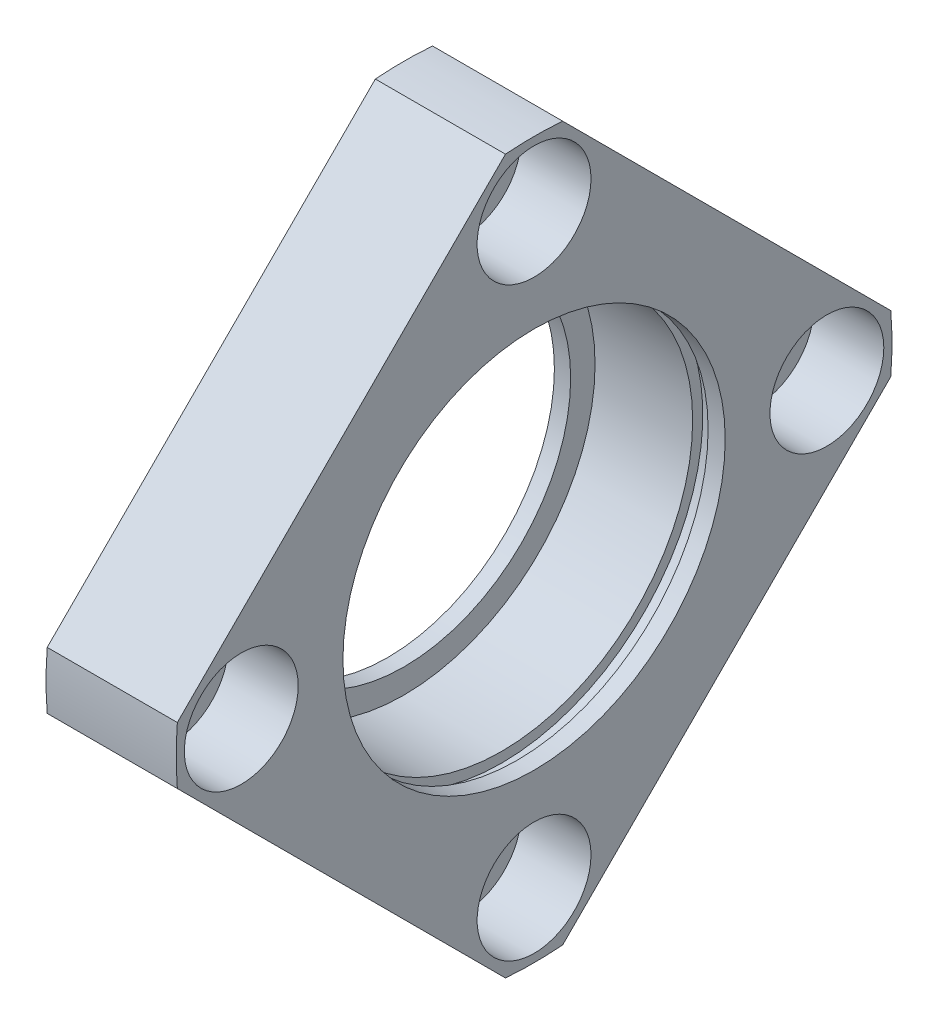
ISO-10303-21;
HEADER;
FILE_DESCRIPTION(('STEP AP214'),'2;1');
FILE_NAME('part.step','',(''),(''),'','','');
FILE_SCHEMA(('AUTOMOTIVE_DESIGN { 1 0 10303 214 1 1 1 1 }'));
ENDSEC;
DATA;
#1=APPLICATION_CONTEXT('core data for automotive mechanical design processes');
#2=APPLICATION_PROTOCOL_DEFINITION('international standard','automotive_design',2000,#1);
#3=PRODUCT_CONTEXT('',#1,'mechanical');
#4=PRODUCT('Part','Part','',(#3));
#5=PRODUCT_RELATED_PRODUCT_CATEGORY('part','',(#4));
#6=PRODUCT_DEFINITION_FORMATION('','',#4);
#7=PRODUCT_DEFINITION_CONTEXT('part definition',#1,'design');
#8=PRODUCT_DEFINITION('design','',#6,#7);
#9=PRODUCT_DEFINITION_SHAPE('','',#8);
#10=(LENGTH_UNIT() NAMED_UNIT(*) SI_UNIT(.MILLI.,.METRE.));
#11=(NAMED_UNIT(*) PLANE_ANGLE_UNIT() SI_UNIT($,.RADIAN.));
#12=(NAMED_UNIT(*) SI_UNIT($,.STERADIAN.) SOLID_ANGLE_UNIT());
#13=UNCERTAINTY_MEASURE_WITH_UNIT(LENGTH_MEASURE(1.E-05),#10,'distance_accuracy_value','');
#14=(GEOMETRIC_REPRESENTATION_CONTEXT(3) GLOBAL_UNCERTAINTY_ASSIGNED_CONTEXT((#13)) GLOBAL_UNIT_ASSIGNED_CONTEXT((#10,
#11,#12)) REPRESENTATION_CONTEXT('',''));
#15=CARTESIAN_POINT('',(0.,0.,0.));
#16=DIRECTION('',(0.,0.,1.));
#17=DIRECTION('',(1.,0.,0.));
#18=AXIS2_PLACEMENT_3D('',#15,#16,#17);
#19=CARTESIAN_POINT('',(-16.,44.,0.));
#20=DIRECTION('',(-1.,0.,0.));
#21=DIRECTION('',(0.,-1.,0.));
#22=AXIS2_PLACEMENT_3D('',#19,#20,#21);
#23=PLANE('',#22);
#24=CARTESIAN_POINT('',(-16.,36.,0.));
#25=DIRECTION('',(-1.,0.,0.));
#26=DIRECTION('',(0.,-1.,0.));
#27=AXIS2_PLACEMENT_3D('',#24,#25,#26);
#28=CIRCLE('',#27,4.25);
#29=CARTESIAN_POINT('',(-16.,31.75,0.));
#30=VERTEX_POINT('',#29);
#31=EDGE_CURVE('E501',#30,#30,#28,.T.);
#32=ORIENTED_EDGE('',*,*,#31,.F.);
#33=EDGE_LOOP('',(#32));
#34=FACE_BOUND('',#33,.T.);
#35=CARTESIAN_POINT('',(-16.,0.,36.));
#36=DIRECTION('',(-1.,0.,0.));
#37=DIRECTION('',(0.,-1.,0.));
#38=AXIS2_PLACEMENT_3D('',#35,#36,#37);
#39=CIRCLE('',#38,4.25);
#40=CARTESIAN_POINT('',(-16.,-4.25,36.));
#41=VERTEX_POINT('',#40);
#42=EDGE_CURVE('E507',#41,#41,#39,.T.);
#43=ORIENTED_EDGE('',*,*,#42,.F.);
#44=EDGE_LOOP('',(#43));
#45=FACE_BOUND('',#44,.T.);
#46=CARTESIAN_POINT('',(-16.,-36.,0.));
#47=DIRECTION('',(-1.,0.,0.));
#48=DIRECTION('',(0.,-1.,0.));
#49=AXIS2_PLACEMENT_3D('',#46,#47,#48);
#50=CIRCLE('',#49,4.25);
#51=CARTESIAN_POINT('',(-16.,-40.25,0.));
#52=VERTEX_POINT('',#51);
#53=EDGE_CURVE('E513',#52,#52,#50,.T.);
#54=ORIENTED_EDGE('',*,*,#53,.F.);
#55=EDGE_LOOP('',(#54));
#56=FACE_BOUND('',#55,.T.);
#57=CARTESIAN_POINT('',(-16.,0.,-36.));
#58=DIRECTION('',(-1.,0.,0.));
#59=DIRECTION('',(0.,-1.,0.));
#60=AXIS2_PLACEMENT_3D('',#57,#58,#59);
#61=CIRCLE('',#60,4.25);
#62=CARTESIAN_POINT('',(-16.,-4.25,-36.));
#63=VERTEX_POINT('',#62);
#64=EDGE_CURVE('E519',#63,#63,#61,.T.);
#65=ORIENTED_EDGE('',*,*,#64,.F.);
#66=EDGE_LOOP('',(#65));
#67=FACE_BOUND('',#66,.T.);
#68=CARTESIAN_POINT('',(-16.,0.,0.));
#69=DIRECTION('',(-1.,0.,0.));
#70=DIRECTION('',(0.,-1.,0.));
#71=AXIS2_PLACEMENT_3D('',#68,#69,#70);
#72=CIRCLE('',#71,27.3);
#73=CARTESIAN_POINT('',(-16.,-27.3,0.));
#74=VERTEX_POINT('',#73);
#75=EDGE_CURVE('E45',#74,#74,#72,.F.);
#76=ORIENTED_EDGE('',*,*,#75,.T.);
#77=EDGE_LOOP('',(#76));
#78=FACE_BOUND('',#77,.T.);
#79=CARTESIAN_POINT('',(-16.,0.,0.));
#80=DIRECTION('',(1.,0.,0.));
#81=DIRECTION('',(0.,1.,0.));
#82=AXIS2_PLACEMENT_3D('',#79,#80,#81);
#83=CIRCLE('',#82,44.);
#84=CARTESIAN_POINT('',(-16.,43.8592199236936,-3.51693441580502));
#85=VERTEX_POINT('',#84);
#86=CARTESIAN_POINT('',(-16.,43.8592199236936,3.51693441580502));
#87=VERTEX_POINT('',#86);
#88=EDGE_CURVE('E133',#85,#87,#83,.T.);
#89=ORIENTED_EDGE('',*,*,#88,.F.);
#90=DIRECTION('',(0.,-0.707106781186548,-0.707106781186548));
#91=VECTOR('',#90,1.);
#92=CARTESIAN_POINT('',(-16.,43.8592199236936,-3.51693441580502));
#93=LINE('',#92,#91);
#94=CARTESIAN_POINT('',(-16.,3.51693441580502,-43.8592199236936));
#95=VERTEX_POINT('',#94);
#96=EDGE_CURVE('E103',#85,#95,#93,.T.);
#97=ORIENTED_EDGE('',*,*,#96,.T.);
#98=CARTESIAN_POINT('',(-16.,-3.51693441580502,-43.8592199236936));
#99=VERTEX_POINT('',#98);
#100=EDGE_CURVE('E135',#99,#95,#83,.T.);
#101=ORIENTED_EDGE('',*,*,#100,.F.);
#102=DIRECTION('',(0.,-0.707106781186548,0.707106781186547));
#103=VECTOR('',#102,1.);
#104=CARTESIAN_POINT('',(-16.,-3.51693441580502,-43.8592199236936));
#105=LINE('',#104,#103);
#106=CARTESIAN_POINT('',(-16.,-43.8592199236936,-3.51693441580504));
#107=VERTEX_POINT('',#106);
#108=EDGE_CURVE('E471',#99,#107,#105,.T.);
#109=ORIENTED_EDGE('',*,*,#108,.T.);
#110=CARTESIAN_POINT('',(-16.,-43.8592199236936,3.51693441580503));
#111=VERTEX_POINT('',#110);
#112=EDGE_CURVE('E136',#111,#107,#83,.T.);
#113=ORIENTED_EDGE('',*,*,#112,.F.);
#114=DIRECTION('',(0.,0.707106781186547,0.707106781186547));
#115=VECTOR('',#114,1.);
#116=CARTESIAN_POINT('',(-16.,-43.8592199236936,3.51693441580503));
#117=LINE('',#116,#115);
#118=CARTESIAN_POINT('',(-16.,-3.51693441580503,43.8592199236936));
#119=VERTEX_POINT('',#118);
#120=EDGE_CURVE('E107',#111,#119,#117,.T.);
#121=ORIENTED_EDGE('',*,*,#120,.T.);
#122=CARTESIAN_POINT('',(-16.,3.51693441580501,43.8592199236936));
#123=VERTEX_POINT('',#122);
#124=EDGE_CURVE('E137',#123,#119,#83,.T.);
#125=ORIENTED_EDGE('',*,*,#124,.F.);
#126=DIRECTION('',(0.,0.707106781186548,-0.707106781186547));
#127=VECTOR('',#126,1.);
#128=CARTESIAN_POINT('',(-16.,3.51693441580501,43.8592199236936));
#129=LINE('',#128,#127);
#130=EDGE_CURVE('E491',#123,#87,#129,.T.);
#131=ORIENTED_EDGE('',*,*,#130,.T.);
#132=EDGE_LOOP('',(#89,#97,#101,#109,#113,#121,#125,#131));
#133=FACE_BOUND('',#132,.T.);
#134=ADVANCED_FACE('F37',(#34,#45,#56,#67,#78,#133),#23,.T.);
#135=CARTESIAN_POINT('',(0.,23.5,0.));
#136=DIRECTION('',(1.,0.,0.));
#137=DIRECTION('',(0.,1.,0.));
#138=AXIS2_PLACEMENT_3D('',#135,#136,#137);
#139=PLANE('',#138);
#140=CARTESIAN_POINT('',(0.,36.,0.));
#141=DIRECTION('',(1.,0.,0.));
#142=DIRECTION('',(0.,0.,-1.));
#143=AXIS2_PLACEMENT_3D('',#140,#141,#142);
#144=CIRCLE('',#143,7.);
#145=CARTESIAN_POINT('',(0.,36.,-7.));
#146=VERTEX_POINT('',#145);
#147=EDGE_CURVE('E522',#146,#146,#144,.T.);
#148=ORIENTED_EDGE('',*,*,#147,.F.);
#149=EDGE_LOOP('',(#148));
#150=FACE_BOUND('',#149,.T.);
#151=CARTESIAN_POINT('',(0.,0.,36.));
#152=DIRECTION('',(1.,0.,0.));
#153=DIRECTION('',(0.,0.,-1.));
#154=AXIS2_PLACEMENT_3D('',#151,#152,#153);
#155=CIRCLE('',#154,7.);
#156=CARTESIAN_POINT('',(0.,0.,29.));
#157=VERTEX_POINT('',#156);
#158=EDGE_CURVE('E528',#157,#157,#155,.T.);
#159=ORIENTED_EDGE('',*,*,#158,.F.);
#160=EDGE_LOOP('',(#159));
#161=FACE_BOUND('',#160,.T.);
#162=CARTESIAN_POINT('',(0.,0.,-36.));
#163=DIRECTION('',(1.,0.,0.));
#164=DIRECTION('',(0.,0.,-1.));
#165=AXIS2_PLACEMENT_3D('',#162,#163,#164);
#166=CIRCLE('',#165,7.);
#167=CARTESIAN_POINT('',(0.,0.,-43.));
#168=VERTEX_POINT('',#167);
#169=EDGE_CURVE('E534',#168,#168,#166,.T.);
#170=ORIENTED_EDGE('',*,*,#169,.F.);
#171=EDGE_LOOP('',(#170));
#172=FACE_BOUND('',#171,.T.);
#173=CARTESIAN_POINT('',(0.,-36.,0.));
#174=DIRECTION('',(1.,0.,0.));
#175=DIRECTION('',(0.,0.,-1.));
#176=AXIS2_PLACEMENT_3D('',#173,#174,#175);
#177=CIRCLE('',#176,7.);
#178=CARTESIAN_POINT('',(0.,-36.,-7.));
#179=VERTEX_POINT('',#178);
#180=EDGE_CURVE('E540',#179,#179,#177,.T.);
#181=ORIENTED_EDGE('',*,*,#180,.F.);
#182=EDGE_LOOP('',(#181));
#183=FACE_BOUND('',#182,.T.);
#184=CARTESIAN_POINT('',(0.,0.,0.));
#185=DIRECTION('',(1.,0.,0.));
#186=DIRECTION('',(0.,1.,0.));
#187=AXIS2_PLACEMENT_3D('',#184,#185,#186);
#188=CIRCLE('',#187,23.5);
#189=CARTESIAN_POINT('',(0.,23.5,0.));
#190=VERTEX_POINT('',#189);
#191=EDGE_CURVE('E124',#190,#190,#188,.T.);
#192=ORIENTED_EDGE('',*,*,#191,.F.);
#193=EDGE_LOOP('',(#192));
#194=FACE_BOUND('',#193,.T.);
#195=CARTESIAN_POINT('',(0.,0.,0.));
#196=DIRECTION('',(1.,0.,0.));
#197=DIRECTION('',(0.,1.,0.));
#198=AXIS2_PLACEMENT_3D('',#195,#196,#197);
#199=CIRCLE('',#198,44.);
#200=CARTESIAN_POINT('',(0.,-3.516934415805,-43.8592199236937));
#201=VERTEX_POINT('',#200);
#202=CARTESIAN_POINT('',(0.,3.51693441580502,-43.8592199236936));
#203=VERTEX_POINT('',#202);
#204=EDGE_CURVE('E118',#201,#203,#199,.T.);
#205=ORIENTED_EDGE('',*,*,#204,.T.);
#206=DIRECTION('',(0.,-0.707106781186548,-0.707106781186548));
#207=VECTOR('',#206,1.);
#208=CARTESIAN_POINT('',(0.,43.8592199236936,-3.51693441580502));
#209=LINE('',#208,#207);
#210=CARTESIAN_POINT('',(0.,43.8592199236936,-3.51693441580502));
#211=VERTEX_POINT('',#210);
#212=EDGE_CURVE('E52',#211,#203,#209,.T.);
#213=ORIENTED_EDGE('',*,*,#212,.F.);
#214=CARTESIAN_POINT('',(0.,43.8592199236936,3.51693441580502));
#215=VERTEX_POINT('',#214);
#216=EDGE_CURVE('E114',#211,#215,#199,.T.);
#217=ORIENTED_EDGE('',*,*,#216,.T.);
#218=DIRECTION('',(0.,0.707106781186548,-0.707106781186547));
#219=VECTOR('',#218,1.);
#220=CARTESIAN_POINT('',(0.,3.51693441580501,43.8592199236936));
#221=LINE('',#220,#219);
#222=CARTESIAN_POINT('',(0.,3.516934415805,43.8592199236937));
#223=VERTEX_POINT('',#222);
#224=EDGE_CURVE('E492',#223,#215,#221,.T.);
#225=ORIENTED_EDGE('',*,*,#224,.F.);
#226=CARTESIAN_POINT('',(0.,-3.51693441580503,43.8592199236936));
#227=VERTEX_POINT('',#226);
#228=EDGE_CURVE('E127',#223,#227,#199,.T.);
#229=ORIENTED_EDGE('',*,*,#228,.T.);
#230=DIRECTION('',(0.,0.707106781186547,0.707106781186547));
#231=VECTOR('',#230,1.);
#232=CARTESIAN_POINT('',(0.,-43.8592199236936,3.51693441580503));
#233=LINE('',#232,#231);
#234=CARTESIAN_POINT('',(0.,-43.8592199236937,3.51693441580501));
#235=VERTEX_POINT('',#234);
#236=EDGE_CURVE('E476',#235,#227,#233,.T.);
#237=ORIENTED_EDGE('',*,*,#236,.F.);
#238=CARTESIAN_POINT('',(0.,-43.8592199236936,-3.51693441580504));
#239=VERTEX_POINT('',#238);
#240=EDGE_CURVE('E126',#235,#239,#199,.T.);
#241=ORIENTED_EDGE('',*,*,#240,.T.);
#242=DIRECTION('',(0.,-0.707106781186548,0.707106781186547));
#243=VECTOR('',#242,1.);
#244=CARTESIAN_POINT('',(0.,-3.51693441580502,-43.8592199236936));
#245=LINE('',#244,#243);
#246=EDGE_CURVE('E483',#201,#239,#245,.T.);
#247=ORIENTED_EDGE('',*,*,#246,.F.);
#248=EDGE_LOOP('',(#205,#213,#217,#225,#229,#237,#241,#247));
#249=FACE_BOUND('',#248,.T.);
#250=ADVANCED_FACE('F112',(#150,#161,#172,#183,#194,#249),#139,.T.);
#251=CARTESIAN_POINT('',(0.,0.,0.));
#252=DIRECTION('',(1.,0.,0.));
#253=DIRECTION('',(0.,1.,0.));
#254=AXIS2_PLACEMENT_3D('',#251,#252,#253);
#255=CYLINDRICAL_SURFACE('',#254,44.);
#256=ORIENTED_EDGE('',*,*,#216,.F.);
#257=DIRECTION('',(-1.,0.,0.));
#258=VECTOR('',#257,1.);
#259=CARTESIAN_POINT('',(0.,43.8592199236936,-3.51693441580502));
#260=LINE('',#259,#258);
#261=EDGE_CURVE('E100',#211,#85,#260,.T.);
#262=ORIENTED_EDGE('',*,*,#261,.T.);
#263=ORIENTED_EDGE('',*,*,#88,.T.);
#264=DIRECTION('',(-1.,0.,0.));
#265=VECTOR('',#264,1.);
#266=CARTESIAN_POINT('',(0.,43.8592199236936,3.51693441580502));
#267=LINE('',#266,#265);
#268=EDGE_CURVE('E123',#215,#87,#267,.T.);
#269=ORIENTED_EDGE('',*,*,#268,.F.);
#270=EDGE_LOOP('',(#256,#262,#263,#269));
#271=FACE_BOUND('',#270,.T.);
#272=ADVANCED_FACE('F121',(#271),#255,.T.);
#273=ORIENTED_EDGE('',*,*,#100,.T.);
#274=DIRECTION('',(-1.,0.,0.));
#275=VECTOR('',#274,1.);
#276=CARTESIAN_POINT('',(0.,3.51693441580502,-43.8592199236936));
#277=LINE('',#276,#275);
#278=EDGE_CURVE('E108',#203,#95,#277,.T.);
#279=ORIENTED_EDGE('',*,*,#278,.F.);
#280=ORIENTED_EDGE('',*,*,#204,.F.);
#281=DIRECTION('',(-1.,0.,0.));
#282=VECTOR('',#281,1.);
#283=CARTESIAN_POINT('',(0.,-3.51693441580502,-43.8592199236936));
#284=LINE('',#283,#282);
#285=EDGE_CURVE('E468',#201,#99,#284,.T.);
#286=ORIENTED_EDGE('',*,*,#285,.T.);
#287=EDGE_LOOP('',(#273,#279,#280,#286));
#288=FACE_BOUND('',#287,.T.);
#289=ADVANCED_FACE('F175',(#288),#255,.T.);
#290=ORIENTED_EDGE('',*,*,#240,.F.);
#291=DIRECTION('',(-1.,0.,0.));
#292=VECTOR('',#291,1.);
#293=CARTESIAN_POINT('',(0.,-43.8592199236936,3.51693441580503));
#294=LINE('',#293,#292);
#295=EDGE_CURVE('E60',#235,#111,#294,.T.);
#296=ORIENTED_EDGE('',*,*,#295,.T.);
#297=ORIENTED_EDGE('',*,*,#112,.T.);
#298=DIRECTION('',(-1.,0.,0.));
#299=VECTOR('',#298,1.);
#300=CARTESIAN_POINT('',(0.,-43.8592199236936,-3.51693441580504));
#301=LINE('',#300,#299);
#302=EDGE_CURVE('E486',#239,#107,#301,.T.);
#303=ORIENTED_EDGE('',*,*,#302,.F.);
#304=EDGE_LOOP('',(#290,#296,#297,#303));
#305=FACE_BOUND('',#304,.T.);
#306=ADVANCED_FACE('F370',(#305),#255,.T.);
#307=ORIENTED_EDGE('',*,*,#124,.T.);
#308=DIRECTION('',(-1.,0.,0.));
#309=VECTOR('',#308,1.);
#310=CARTESIAN_POINT('',(0.,-3.51693441580503,43.8592199236936));
#311=LINE('',#310,#309);
#312=EDGE_CURVE('E478',#227,#119,#311,.T.);
#313=ORIENTED_EDGE('',*,*,#312,.F.);
#314=ORIENTED_EDGE('',*,*,#228,.F.);
#315=DIRECTION('',(-1.,0.,0.));
#316=VECTOR('',#315,1.);
#317=CARTESIAN_POINT('',(0.,3.51693441580501,43.8592199236936));
#318=LINE('',#317,#316);
#319=EDGE_CURVE('E496',#223,#123,#318,.T.);
#320=ORIENTED_EDGE('',*,*,#319,.T.);
#321=EDGE_LOOP('',(#307,#313,#314,#320));
#322=FACE_BOUND('',#321,.T.);
#323=ADVANCED_FACE('F176',(#322),#255,.T.);
#324=CARTESIAN_POINT('',(0.,0.,0.));
#325=DIRECTION('',(1.,0.,0.));
#326=DIRECTION('',(0.,1.,0.));
#327=AXIS2_PLACEMENT_3D('',#324,#325,#326);
#328=CYLINDRICAL_SURFACE('',#327,23.5);
#329=ORIENTED_EDGE('',*,*,#191,.T.);
#330=EDGE_LOOP('',(#329));
#331=FACE_BOUND('',#330,.T.);
#332=CARTESIAN_POINT('',(-2.1,0.,0.));
#333=DIRECTION('',(1.,0.,0.));
#334=DIRECTION('',(0.,1.,0.));
#335=AXIS2_PLACEMENT_3D('',#332,#333,#334);
#336=CIRCLE('',#335,23.5);
#337=CARTESIAN_POINT('',(-2.1,23.5,0.));
#338=VERTEX_POINT('',#337);
#339=EDGE_CURVE('E129',#338,#338,#336,.T.);
#340=ORIENTED_EDGE('',*,*,#339,.F.);
#341=EDGE_LOOP('',(#340));
#342=FACE_BOUND('',#341,.T.);
#343=ADVANCED_FACE('F178',(#331,#342),#328,.F.);
#344=CARTESIAN_POINT('',(-2.1,24.75,0.));
#345=DIRECTION('',(-1.,0.,0.));
#346=DIRECTION('',(0.,-1.,0.));
#347=AXIS2_PLACEMENT_3D('',#344,#345,#346);
#348=PLANE('',#347);
#349=ORIENTED_EDGE('',*,*,#339,.T.);
#350=EDGE_LOOP('',(#349));
#351=FACE_BOUND('',#350,.T.);
#352=CARTESIAN_POINT('',(-2.1,0.,0.));
#353=DIRECTION('',(1.,0.,0.));
#354=DIRECTION('',(0.,1.,0.));
#355=AXIS2_PLACEMENT_3D('',#352,#353,#354);
#356=CIRCLE('',#355,24.75);
#357=CARTESIAN_POINT('',(-2.1,24.75,0.));
#358=VERTEX_POINT('',#357);
#359=EDGE_CURVE('E564',#358,#358,#356,.T.);
#360=ORIENTED_EDGE('',*,*,#359,.F.);
#361=EDGE_LOOP('',(#360));
#362=FACE_BOUND('',#361,.T.);
#363=ADVANCED_FACE('F181',(#351,#362),#348,.T.);
#364=CARTESIAN_POINT('',(0.,0.,0.));
#365=DIRECTION('',(1.,0.,0.));
#366=DIRECTION('',(0.,1.,0.));
#367=AXIS2_PLACEMENT_3D('',#364,#365,#366);
#368=CYLINDRICAL_SURFACE('',#367,24.75);
#369=ORIENTED_EDGE('',*,*,#359,.T.);
#370=EDGE_LOOP('',(#369));
#371=FACE_BOUND('',#370,.T.);
#372=CARTESIAN_POINT('',(-4.,0.,0.));
#373=DIRECTION('',(1.,0.,0.));
#374=DIRECTION('',(0.,1.,0.));
#375=AXIS2_PLACEMENT_3D('',#372,#373,#374);
#376=CIRCLE('',#375,24.75);
#377=CARTESIAN_POINT('',(-4.,24.75,0.));
#378=VERTEX_POINT('',#377);
#379=EDGE_CURVE('E561',#378,#378,#376,.T.);
#380=ORIENTED_EDGE('',*,*,#379,.F.);
#381=EDGE_LOOP('',(#380));
#382=FACE_BOUND('',#381,.T.);
#383=ADVANCED_FACE('F185',(#371,#382),#368,.F.);
#384=CARTESIAN_POINT('',(-4.,23.5,0.));
#385=DIRECTION('',(1.,0.,0.));
#386=DIRECTION('',(0.,1.,0.));
#387=AXIS2_PLACEMENT_3D('',#384,#385,#386);
#388=PLANE('',#387);
#389=ORIENTED_EDGE('',*,*,#379,.T.);
#390=EDGE_LOOP('',(#389));
#391=FACE_BOUND('',#390,.T.);
#392=CARTESIAN_POINT('',(-4.,0.,0.));
#393=DIRECTION('',(1.,0.,0.));
#394=DIRECTION('',(0.,1.,0.));
#395=AXIS2_PLACEMENT_3D('',#392,#393,#394);
#396=CIRCLE('',#395,23.5);
#397=CARTESIAN_POINT('',(-4.,23.5,0.));
#398=VERTEX_POINT('',#397);
#399=EDGE_CURVE('E558',#398,#398,#396,.T.);
#400=ORIENTED_EDGE('',*,*,#399,.F.);
#401=EDGE_LOOP('',(#400));
#402=FACE_BOUND('',#401,.T.);
#403=ADVANCED_FACE('F189',(#391,#402),#388,.T.);
#404=CARTESIAN_POINT('',(0.,0.,0.));
#405=DIRECTION('',(1.,0.,0.));
#406=DIRECTION('',(0.,1.,0.));
#407=AXIS2_PLACEMENT_3D('',#404,#405,#406);
#408=CYLINDRICAL_SURFACE('',#407,23.5);
#409=ORIENTED_EDGE('',*,*,#399,.T.);
#410=EDGE_LOOP('',(#409));
#411=FACE_BOUND('',#410,.T.);
#412=CARTESIAN_POINT('',(-16.,0.,0.));
#413=DIRECTION('',(1.,0.,0.));
#414=DIRECTION('',(0.,1.,0.));
#415=AXIS2_PLACEMENT_3D('',#412,#413,#414);
#416=CIRCLE('',#415,23.5);
#417=CARTESIAN_POINT('',(-16.,23.5,0.));
#418=VERTEX_POINT('',#417);
#419=EDGE_CURVE('E555',#418,#418,#416,.T.);
#420=ORIENTED_EDGE('',*,*,#419,.F.);
#421=EDGE_LOOP('',(#420));
#422=FACE_BOUND('',#421,.T.);
#423=ADVANCED_FACE('F193',(#411,#422),#408,.F.);
#424=CARTESIAN_POINT('',(-16.,20.5,0.));
#425=DIRECTION('',(1.,0.,0.));
#426=DIRECTION('',(0.,1.,0.));
#427=AXIS2_PLACEMENT_3D('',#424,#425,#426);
#428=PLANE('',#427);
#429=ORIENTED_EDGE('',*,*,#419,.T.);
#430=EDGE_LOOP('',(#429));
#431=FACE_BOUND('',#430,.T.);
#432=CARTESIAN_POINT('',(-16.,0.,0.));
#433=DIRECTION('',(1.,0.,0.));
#434=DIRECTION('',(0.,1.,0.));
#435=AXIS2_PLACEMENT_3D('',#432,#433,#434);
#436=CIRCLE('',#435,20.5);
#437=CARTESIAN_POINT('',(-16.,20.5,0.));
#438=VERTEX_POINT('',#437);
#439=EDGE_CURVE('E552',#438,#438,#436,.T.);
#440=ORIENTED_EDGE('',*,*,#439,.F.);
#441=EDGE_LOOP('',(#440));
#442=FACE_BOUND('',#441,.T.);
#443=ADVANCED_FACE('F197',(#431,#442),#428,.T.);
#444=CARTESIAN_POINT('',(0.,0.,0.));
#445=DIRECTION('',(1.,0.,0.));
#446=DIRECTION('',(0.,1.,0.));
#447=AXIS2_PLACEMENT_3D('',#444,#445,#446);
#448=CYLINDRICAL_SURFACE('',#447,20.5);
#449=ORIENTED_EDGE('',*,*,#439,.T.);
#450=EDGE_LOOP('',(#449));
#451=FACE_BOUND('',#450,.T.);
#452=CARTESIAN_POINT('',(-18.,0.,0.));
#453=DIRECTION('',(1.,0.,0.));
#454=DIRECTION('',(0.,1.,0.));
#455=AXIS2_PLACEMENT_3D('',#452,#453,#454);
#456=CIRCLE('',#455,20.5);
#457=CARTESIAN_POINT('',(-18.,20.5,0.));
#458=VERTEX_POINT('',#457);
#459=EDGE_CURVE('E549',#458,#458,#456,.T.);
#460=ORIENTED_EDGE('',*,*,#459,.F.);
#461=EDGE_LOOP('',(#460));
#462=FACE_BOUND('',#461,.T.);
#463=ADVANCED_FACE('F201',(#451,#462),#448,.F.);
#464=CARTESIAN_POINT('',(-18.,27.,0.));
#465=DIRECTION('',(-1.,0.,0.));
#466=DIRECTION('',(0.,-1.,0.));
#467=AXIS2_PLACEMENT_3D('',#464,#465,#466);
#468=PLANE('',#467);
#469=ORIENTED_EDGE('',*,*,#459,.T.);
#470=EDGE_LOOP('',(#469));
#471=FACE_BOUND('',#470,.T.);
#472=CARTESIAN_POINT('',(-18.,0.,0.));
#473=DIRECTION('',(1.,0.,0.));
#474=DIRECTION('',(0.,1.,0.));
#475=AXIS2_PLACEMENT_3D('',#472,#473,#474);
#476=CIRCLE('',#475,27.);
#477=CARTESIAN_POINT('',(-18.,27.,0.));
#478=VERTEX_POINT('',#477);
#479=EDGE_CURVE('E546',#478,#478,#476,.T.);
#480=ORIENTED_EDGE('',*,*,#479,.F.);
#481=EDGE_LOOP('',(#480));
#482=FACE_BOUND('',#481,.T.);
#483=ADVANCED_FACE('F160',(#471,#482),#468,.T.);
#484=CARTESIAN_POINT('',(0.,0.,0.));
#485=DIRECTION('',(1.,0.,0.));
#486=DIRECTION('',(0.,1.,0.));
#487=AXIS2_PLACEMENT_3D('',#484,#485,#486);
#488=CYLINDRICAL_SURFACE('',#487,27.);
#489=CARTESIAN_POINT('',(-16.3,0.,0.));
#490=DIRECTION('',(-1.,0.,0.));
#491=DIRECTION('',(0.,-1.,0.));
#492=AXIS2_PLACEMENT_3D('',#489,#490,#491);
#493=CIRCLE('',#492,27.);
#494=CARTESIAN_POINT('',(-16.3,-27.,0.));
#495=VERTEX_POINT('',#494);
#496=EDGE_CURVE('E11',#495,#495,#493,.T.);
#497=ORIENTED_EDGE('',*,*,#496,.T.);
#498=EDGE_LOOP('',(#497));
#499=FACE_BOUND('',#498,.T.);
#500=ORIENTED_EDGE('',*,*,#479,.T.);
#501=EDGE_LOOP('',(#500));
#502=FACE_BOUND('',#501,.T.);
#503=ADVANCED_FACE('F151',(#499,#502),#488,.T.);
#504=CARTESIAN_POINT('',(-16.3,0.,0.));
#505=DIRECTION('',(-1.,0.,0.));
#506=DIRECTION('',(0.,-1.,0.));
#507=AXIS2_PLACEMENT_3D('',#504,#505,#506);
#508=TOROIDAL_SURFACE('',#507,27.3,0.3);
#509=ORIENTED_EDGE('',*,*,#496,.F.);
#510=EDGE_LOOP('',(#509));
#511=FACE_BOUND('',#510,.T.);
#512=ORIENTED_EDGE('',*,*,#75,.F.);
#513=EDGE_LOOP('',(#512));
#514=FACE_BOUND('',#513,.T.);
#515=ADVANCED_FACE('F39',(#511,#514),#508,.F.);
#516=CARTESIAN_POINT('',(-8.6,-36.,0.));
#517=DIRECTION('',(-1.,0.,0.));
#518=DIRECTION('',(0.,0.,1.));
#519=AXIS2_PLACEMENT_3D('',#516,#517,#518);
#520=PLANE('',#519);
#521=CARTESIAN_POINT('',(-8.6,-36.,0.));
#522=DIRECTION('',(1.,0.,0.));
#523=DIRECTION('',(0.,0.,-1.));
#524=AXIS2_PLACEMENT_3D('',#521,#522,#523);
#525=CIRCLE('',#524,4.25);
#526=CARTESIAN_POINT('',(-8.6,-36.,-4.25));
#527=VERTEX_POINT('',#526);
#528=EDGE_CURVE('E510',#527,#527,#525,.T.);
#529=ORIENTED_EDGE('',*,*,#528,.F.);
#530=EDGE_LOOP('',(#529));
#531=FACE_BOUND('',#530,.T.);
#532=CARTESIAN_POINT('',(-8.6,-36.,0.));
#533=DIRECTION('',(1.,0.,0.));
#534=DIRECTION('',(0.,0.,-1.));
#535=AXIS2_PLACEMENT_3D('',#532,#533,#534);
#536=CIRCLE('',#535,7.);
#537=CARTESIAN_POINT('',(-8.6,-36.,-7.));
#538=VERTEX_POINT('',#537);
#539=EDGE_CURVE('E543',#538,#538,#536,.T.);
#540=ORIENTED_EDGE('',*,*,#539,.T.);
#541=EDGE_LOOP('',(#540));
#542=FACE_BOUND('',#541,.T.);
#543=ADVANCED_FACE('F150',(#531,#542),#520,.F.);
#544=CARTESIAN_POINT('',(0.,-36.,0.));
#545=DIRECTION('',(1.,0.,0.));
#546=DIRECTION('',(0.,0.,-1.));
#547=AXIS2_PLACEMENT_3D('',#544,#545,#546);
#548=CYLINDRICAL_SURFACE('',#547,7.);
#549=ORIENTED_EDGE('',*,*,#539,.F.);
#550=EDGE_LOOP('',(#549));
#551=FACE_BOUND('',#550,.T.);
#552=ORIENTED_EDGE('',*,*,#180,.T.);
#553=EDGE_LOOP('',(#552));
#554=FACE_BOUND('',#553,.T.);
#555=ADVANCED_FACE('F157',(#551,#554),#548,.F.);
#556=CARTESIAN_POINT('',(-8.6,0.,-36.));
#557=DIRECTION('',(-1.,0.,0.));
#558=DIRECTION('',(0.,0.,1.));
#559=AXIS2_PLACEMENT_3D('',#556,#557,#558);
#560=PLANE('',#559);
#561=CARTESIAN_POINT('',(-8.6,0.,-36.));
#562=DIRECTION('',(1.,0.,0.));
#563=DIRECTION('',(0.,0.,-1.));
#564=AXIS2_PLACEMENT_3D('',#561,#562,#563);
#565=CIRCLE('',#564,4.25);
#566=CARTESIAN_POINT('',(-8.6,0.,-40.25));
#567=VERTEX_POINT('',#566);
#568=EDGE_CURVE('E516',#567,#567,#565,.T.);
#569=ORIENTED_EDGE('',*,*,#568,.F.);
#570=EDGE_LOOP('',(#569));
#571=FACE_BOUND('',#570,.T.);
#572=CARTESIAN_POINT('',(-8.6,0.,-36.));
#573=DIRECTION('',(1.,0.,0.));
#574=DIRECTION('',(0.,0.,-1.));
#575=AXIS2_PLACEMENT_3D('',#572,#573,#574);
#576=CIRCLE('',#575,7.);
#577=CARTESIAN_POINT('',(-8.6,0.,-43.));
#578=VERTEX_POINT('',#577);
#579=EDGE_CURVE('E537',#578,#578,#576,.T.);
#580=ORIENTED_EDGE('',*,*,#579,.T.);
#581=EDGE_LOOP('',(#580));
#582=FACE_BOUND('',#581,.T.);
#583=ADVANCED_FACE('F211',(#571,#582),#560,.F.);
#584=CARTESIAN_POINT('',(0.,0.,-36.));
#585=DIRECTION('',(1.,0.,0.));
#586=DIRECTION('',(0.,0.,-1.));
#587=AXIS2_PLACEMENT_3D('',#584,#585,#586);
#588=CYLINDRICAL_SURFACE('',#587,7.);
#589=ORIENTED_EDGE('',*,*,#579,.F.);
#590=EDGE_LOOP('',(#589));
#591=FACE_BOUND('',#590,.T.);
#592=ORIENTED_EDGE('',*,*,#169,.T.);
#593=EDGE_LOOP('',(#592));
#594=FACE_BOUND('',#593,.T.);
#595=ADVANCED_FACE('F215',(#591,#594),#588,.F.);
#596=CARTESIAN_POINT('',(-8.6,0.,36.));
#597=DIRECTION('',(-1.,0.,0.));
#598=DIRECTION('',(0.,0.,1.));
#599=AXIS2_PLACEMENT_3D('',#596,#597,#598);
#600=PLANE('',#599);
#601=CARTESIAN_POINT('',(-8.6,0.,36.));
#602=DIRECTION('',(1.,0.,0.));
#603=DIRECTION('',(0.,0.,-1.));
#604=AXIS2_PLACEMENT_3D('',#601,#602,#603);
#605=CIRCLE('',#604,4.25);
#606=CARTESIAN_POINT('',(-8.6,0.,31.75));
#607=VERTEX_POINT('',#606);
#608=EDGE_CURVE('E504',#607,#607,#605,.T.);
#609=ORIENTED_EDGE('',*,*,#608,.F.);
#610=EDGE_LOOP('',(#609));
#611=FACE_BOUND('',#610,.T.);
#612=CARTESIAN_POINT('',(-8.6,0.,36.));
#613=DIRECTION('',(1.,0.,0.));
#614=DIRECTION('',(0.,0.,-1.));
#615=AXIS2_PLACEMENT_3D('',#612,#613,#614);
#616=CIRCLE('',#615,7.);
#617=CARTESIAN_POINT('',(-8.6,0.,29.));
#618=VERTEX_POINT('',#617);
#619=EDGE_CURVE('E531',#618,#618,#616,.T.);
#620=ORIENTED_EDGE('',*,*,#619,.T.);
#621=EDGE_LOOP('',(#620));
#622=FACE_BOUND('',#621,.T.);
#623=ADVANCED_FACE('F219',(#611,#622),#600,.F.);
#624=CARTESIAN_POINT('',(0.,0.,36.));
#625=DIRECTION('',(1.,0.,0.));
#626=DIRECTION('',(0.,0.,-1.));
#627=AXIS2_PLACEMENT_3D('',#624,#625,#626);
#628=CYLINDRICAL_SURFACE('',#627,7.);
#629=ORIENTED_EDGE('',*,*,#619,.F.);
#630=EDGE_LOOP('',(#629));
#631=FACE_BOUND('',#630,.T.);
#632=ORIENTED_EDGE('',*,*,#158,.T.);
#633=EDGE_LOOP('',(#632));
#634=FACE_BOUND('',#633,.T.);
#635=ADVANCED_FACE('F223',(#631,#634),#628,.F.);
#636=CARTESIAN_POINT('',(-8.6,36.,0.));
#637=DIRECTION('',(-1.,0.,0.));
#638=DIRECTION('',(0.,0.,1.));
#639=AXIS2_PLACEMENT_3D('',#636,#637,#638);
#640=PLANE('',#639);
#641=CARTESIAN_POINT('',(-8.6,36.,0.));
#642=DIRECTION('',(1.,0.,0.));
#643=DIRECTION('',(0.,0.,-1.));
#644=AXIS2_PLACEMENT_3D('',#641,#642,#643);
#645=CIRCLE('',#644,4.25);
#646=CARTESIAN_POINT('',(-8.6,36.,-4.25));
#647=VERTEX_POINT('',#646);
#648=EDGE_CURVE('E498',#647,#647,#645,.T.);
#649=ORIENTED_EDGE('',*,*,#648,.F.);
#650=EDGE_LOOP('',(#649));
#651=FACE_BOUND('',#650,.T.);
#652=CARTESIAN_POINT('',(-8.6,36.,0.));
#653=DIRECTION('',(1.,0.,0.));
#654=DIRECTION('',(0.,0.,-1.));
#655=AXIS2_PLACEMENT_3D('',#652,#653,#654);
#656=CIRCLE('',#655,7.);
#657=CARTESIAN_POINT('',(-8.6,36.,-7.));
#658=VERTEX_POINT('',#657);
#659=EDGE_CURVE('E525',#658,#658,#656,.T.);
#660=ORIENTED_EDGE('',*,*,#659,.T.);
#661=EDGE_LOOP('',(#660));
#662=FACE_BOUND('',#661,.T.);
#663=ADVANCED_FACE('F227',(#651,#662),#640,.F.);
#664=CARTESIAN_POINT('',(0.,36.,0.));
#665=DIRECTION('',(1.,0.,0.));
#666=DIRECTION('',(0.,0.,-1.));
#667=AXIS2_PLACEMENT_3D('',#664,#665,#666);
#668=CYLINDRICAL_SURFACE('',#667,7.);
#669=ORIENTED_EDGE('',*,*,#659,.F.);
#670=EDGE_LOOP('',(#669));
#671=FACE_BOUND('',#670,.T.);
#672=ORIENTED_EDGE('',*,*,#147,.T.);
#673=EDGE_LOOP('',(#672));
#674=FACE_BOUND('',#673,.T.);
#675=ADVANCED_FACE('F231',(#671,#674),#668,.F.);
#676=CARTESIAN_POINT('',(-8.6,0.,-36.));
#677=DIRECTION('',(1.,0.,0.));
#678=DIRECTION('',(0.,0.,-1.));
#679=AXIS2_PLACEMENT_3D('',#676,#677,#678);
#680=CYLINDRICAL_SURFACE('',#679,4.25);
#681=ORIENTED_EDGE('',*,*,#64,.T.);
#682=EDGE_LOOP('',(#681));
#683=FACE_BOUND('',#682,.T.);
#684=ORIENTED_EDGE('',*,*,#568,.T.);
#685=EDGE_LOOP('',(#684));
#686=FACE_BOUND('',#685,.T.);
#687=ADVANCED_FACE('F235',(#683,#686),#680,.F.);
#688=CARTESIAN_POINT('',(-8.6,-36.,0.));
#689=DIRECTION('',(1.,0.,0.));
#690=DIRECTION('',(0.,0.,-1.));
#691=AXIS2_PLACEMENT_3D('',#688,#689,#690);
#692=CYLINDRICAL_SURFACE('',#691,4.25);
#693=ORIENTED_EDGE('',*,*,#53,.T.);
#694=EDGE_LOOP('',(#693));
#695=FACE_BOUND('',#694,.T.);
#696=ORIENTED_EDGE('',*,*,#528,.T.);
#697=EDGE_LOOP('',(#696));
#698=FACE_BOUND('',#697,.T.);
#699=ADVANCED_FACE('F239',(#695,#698),#692,.F.);
#700=CARTESIAN_POINT('',(-8.6,0.,36.));
#701=DIRECTION('',(1.,0.,0.));
#702=DIRECTION('',(0.,0.,-1.));
#703=AXIS2_PLACEMENT_3D('',#700,#701,#702);
#704=CYLINDRICAL_SURFACE('',#703,4.25);
#705=ORIENTED_EDGE('',*,*,#42,.T.);
#706=EDGE_LOOP('',(#705));
#707=FACE_BOUND('',#706,.T.);
#708=ORIENTED_EDGE('',*,*,#608,.T.);
#709=EDGE_LOOP('',(#708));
#710=FACE_BOUND('',#709,.T.);
#711=ADVANCED_FACE('F243',(#707,#710),#704,.F.);
#712=CARTESIAN_POINT('',(-8.6,36.,0.));
#713=DIRECTION('',(1.,0.,0.));
#714=DIRECTION('',(0.,0.,-1.));
#715=AXIS2_PLACEMENT_3D('',#712,#713,#714);
#716=CYLINDRICAL_SURFACE('',#715,4.25);
#717=ORIENTED_EDGE('',*,*,#31,.T.);
#718=EDGE_LOOP('',(#717));
#719=FACE_BOUND('',#718,.T.);
#720=ORIENTED_EDGE('',*,*,#648,.T.);
#721=EDGE_LOOP('',(#720));
#722=FACE_BOUND('',#721,.T.);
#723=ADVANCED_FACE('F247',(#719,#722),#716,.F.);
#724=CARTESIAN_POINT('',(0.,3.51693441580501,43.8592199236936));
#725=DIRECTION('',(0.,0.707106781186547,0.707106781186548));
#726=DIRECTION('',(0.,-0.707106781186548,0.707106781186547));
#727=AXIS2_PLACEMENT_3D('',#724,#725,#726);
#728=PLANE('',#727);
#729=ORIENTED_EDGE('',*,*,#130,.F.);
#730=ORIENTED_EDGE('',*,*,#319,.F.);
#731=ORIENTED_EDGE('',*,*,#224,.T.);
#732=ORIENTED_EDGE('',*,*,#268,.T.);
#733=EDGE_LOOP('',(#729,#730,#731,#732));
#734=FACE_BOUND('',#733,.T.);
#735=ADVANCED_FACE('F251',(#734),#728,.T.);
#736=CARTESIAN_POINT('',(0.,-3.51693441580502,-43.8592199236936));
#737=DIRECTION('',(0.,-0.707106781186547,-0.707106781186548));
#738=DIRECTION('',(0.,0.707106781186548,-0.707106781186547));
#739=AXIS2_PLACEMENT_3D('',#736,#737,#738);
#740=PLANE('',#739);
#741=ORIENTED_EDGE('',*,*,#108,.F.);
#742=ORIENTED_EDGE('',*,*,#285,.F.);
#743=ORIENTED_EDGE('',*,*,#246,.T.);
#744=ORIENTED_EDGE('',*,*,#302,.T.);
#745=EDGE_LOOP('',(#741,#742,#743,#744));
#746=FACE_BOUND('',#745,.T.);
#747=ADVANCED_FACE('F255',(#746),#740,.T.);
#748=CARTESIAN_POINT('',(0.,-43.8592199236936,3.51693441580503));
#749=DIRECTION('',(0.,-0.707106781186548,0.707106781186548));
#750=DIRECTION('',(0.,-0.707106781186548,-0.707106781186548));
#751=AXIS2_PLACEMENT_3D('',#748,#749,#750);
#752=PLANE('',#751);
#753=ORIENTED_EDGE('',*,*,#120,.F.);
#754=ORIENTED_EDGE('',*,*,#295,.F.);
#755=ORIENTED_EDGE('',*,*,#236,.T.);
#756=ORIENTED_EDGE('',*,*,#312,.T.);
#757=EDGE_LOOP('',(#753,#754,#755,#756));
#758=FACE_BOUND('',#757,.T.);
#759=ADVANCED_FACE('F259',(#758),#752,.T.);
#760=CARTESIAN_POINT('',(0.,43.8592199236936,-3.51693441580502));
#761=DIRECTION('',(0.,0.707106781186548,-0.707106781186548));
#762=DIRECTION('',(0.,0.707106781186548,0.707106781186548));
#763=AXIS2_PLACEMENT_3D('',#760,#761,#762);
#764=PLANE('',#763);
#765=ORIENTED_EDGE('',*,*,#96,.F.);
#766=ORIENTED_EDGE('',*,*,#261,.F.);
#767=ORIENTED_EDGE('',*,*,#212,.T.);
#768=ORIENTED_EDGE('',*,*,#278,.T.);
#769=EDGE_LOOP('',(#765,#766,#767,#768));
#770=FACE_BOUND('',#769,.T.);
#771=ADVANCED_FACE('F101',(#770),#764,.T.);
#772=CLOSED_SHELL('',(#134,#250,#272,#289,#306,#323,#343,#363,#383,#403,#423,#443,#463,#483,
#503,#515,#543,#555,#583,#595,#623,#635,#663,#675,#687,#699,#711,#723,#735,#747,#759,#771));
#773=MANIFOLD_SOLID_BREP('B2',#772);
#774=ADVANCED_BREP_SHAPE_REPRESENTATION('',(#18,#773),#14);
#775=SHAPE_DEFINITION_REPRESENTATION(#9,#774);
ENDSEC;
END-ISO-10303-21;
